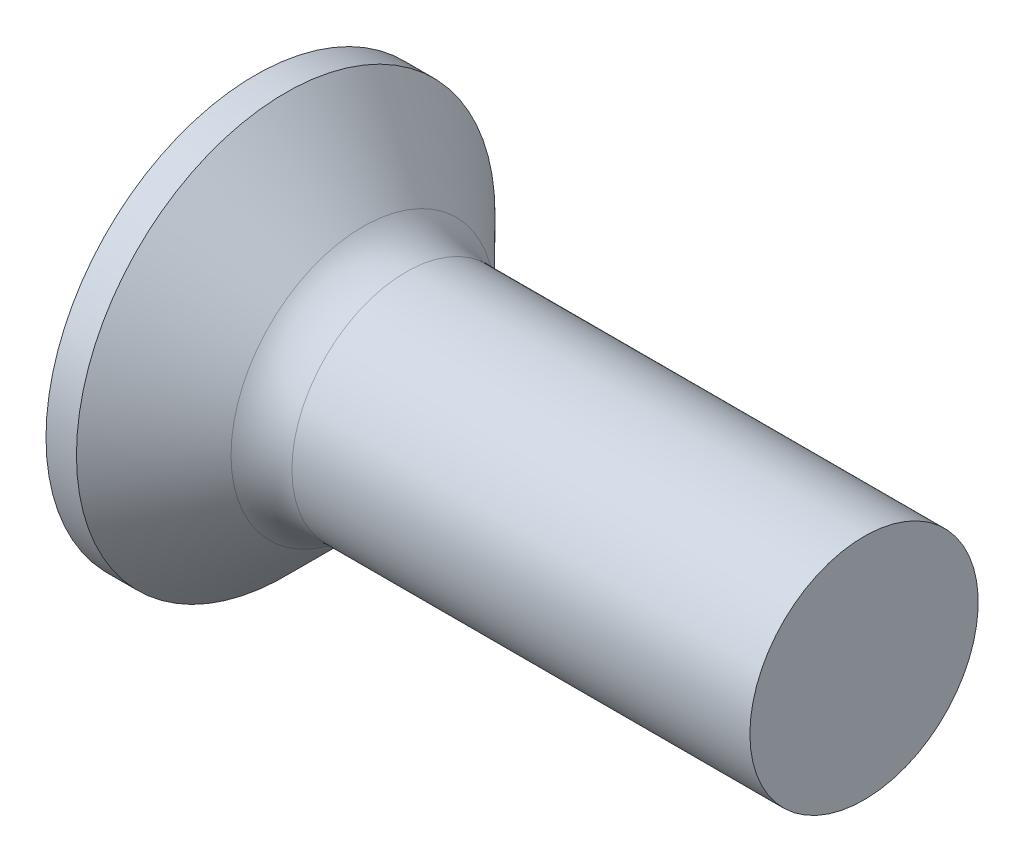
ISO-10303-21;
HEADER;
FILE_DESCRIPTION(('STEP AP214'),'2;1');
FILE_NAME('part.step','',(''),(''),'','','');
FILE_SCHEMA(('AUTOMOTIVE_DESIGN { 1 0 10303 214 1 1 1 1 }'));
ENDSEC;
DATA;
#1=APPLICATION_CONTEXT('core data for automotive mechanical design processes');
#2=APPLICATION_PROTOCOL_DEFINITION('international standard','automotive_design',2000,#1);
#3=PRODUCT_CONTEXT('',#1,'mechanical');
#4=PRODUCT('Part','Part','',(#3));
#5=PRODUCT_RELATED_PRODUCT_CATEGORY('part','',(#4));
#6=PRODUCT_DEFINITION_FORMATION('','',#4);
#7=PRODUCT_DEFINITION_CONTEXT('part definition',#1,'design');
#8=PRODUCT_DEFINITION('design','',#6,#7);
#9=PRODUCT_DEFINITION_SHAPE('','',#8);
#10=(LENGTH_UNIT() NAMED_UNIT(*) SI_UNIT(.MILLI.,.METRE.));
#11=(NAMED_UNIT(*) PLANE_ANGLE_UNIT() SI_UNIT($,.RADIAN.));
#12=(NAMED_UNIT(*) SI_UNIT($,.STERADIAN.) SOLID_ANGLE_UNIT());
#13=UNCERTAINTY_MEASURE_WITH_UNIT(LENGTH_MEASURE(1.E-05),#10,'distance_accuracy_value','');
#14=(GEOMETRIC_REPRESENTATION_CONTEXT(3) GLOBAL_UNCERTAINTY_ASSIGNED_CONTEXT((#13)) GLOBAL_UNIT_ASSIGNED_CONTEXT((#10,
#11,#12)) REPRESENTATION_CONTEXT('',''));
#15=CARTESIAN_POINT('',(0.,0.,0.));
#16=DIRECTION('',(0.,0.,1.));
#17=DIRECTION('',(1.,0.,0.));
#18=AXIS2_PLACEMENT_3D('',#15,#16,#17);
#19=CARTESIAN_POINT('',(2.01,-0.497851135403417,0.37));
#20=DIRECTION('',(0.,0.,-1.));
#21=DIRECTION('',(0.,1.,0.));
#22=AXIS2_PLACEMENT_3D('',#19,#20,#21);
#23=PLANE('',#22);
#24=DIRECTION('',(0.,-1.,0.));
#25=VECTOR('',#24,1.);
#26=CARTESIAN_POINT('',(0.,1.5,0.37));
#27=LINE('',#26,#25);
#28=CARTESIAN_POINT('',(0.,-0.590157547916263,0.37));
#29=VERTEX_POINT('',#28);
#30=CARTESIAN_POINT('',(0.,-1.5,0.37));
#31=VERTEX_POINT('',#30);
#32=EDGE_CURVE('E463',#29,#31,#27,.T.);
#33=ORIENTED_EDGE('',*,*,#32,.F.);
#34=CARTESIAN_POINT('',(-1.01053649691082,-0.672102030072118,0.37));
#35=CARTESIAN_POINT('',(-0.79970605871103,-0.655267098883947,0.37));
#36=CARTESIAN_POINT('',(-0.588886212503304,-0.638297110572311,0.37));
#37=CARTESIAN_POINT('',(-0.167272662529611,-0.603984130519828,0.37));
#38=CARTESIAN_POINT('',(0.0435210406290472,-0.586641131324258,0.37));
#39=CARTESIAN_POINT('',(0.465068838244709,-0.551479911667385,0.37));
#40=CARTESIAN_POINT('',(0.67582293271526,-0.533661691368909,0.37));
#41=CARTESIAN_POINT('',(1.09727362083221,-0.497387538872971,0.37));
#42=CARTESIAN_POINT('',(1.30797021521736,-0.478931615299089,0.37));
#43=CARTESIAN_POINT('',(1.67418894757201,-0.446067164121906,0.37));
#44=CARTESIAN_POINT('',(1.82972932585734,-0.431862501028414,0.37));
#45=CARTESIAN_POINT('',(2.14074770359484,-0.40279770973988,0.37));
#46=CARTESIAN_POINT('',(2.29622570356215,-0.38793758707517,0.37));
#47=CARTESIAN_POINT('',(2.60710169348415,-0.357305117937677,0.37));
#48=CARTESIAN_POINT('',(2.76249967840253,-0.34153271979064,0.37));
#49=CARTESIAN_POINT('',(2.99549070742189,-0.316847908281595,0.37));
#50=CARTESIAN_POINT('',(3.07313791118864,-0.308448465897182,0.37));
#51=CARTESIAN_POINT('',(3.22838341575769,-0.29120225104834,0.37));
#52=CARTESIAN_POINT('',(3.30598171599396,-0.282355473499083,0.37));
#53=CARTESIAN_POINT('',(3.38354828463398,-0.273232461289951,0.37));
#54=B_SPLINE_CURVE_WITH_KNOTS('',3,(#34,#35,#36,#37,#38,#39,#40,#41,#42,#43,#44,#45,#46,#47,#48,
#49,#50,#51,#52,#53),.UNSPECIFIED.,.F.,.F.,(4,2,2,2,2,2,2,2,2,4),(0.,0.634504777554397,
1.26902224766093,1.90353950036111,2.53804817592041,3.00661008438666,3.47516804019383,
3.94375256268972,4.17805198331268,4.41235406779909),.UNSPECIFIED.);
#55=CARTESIAN_POINT('',(2.01,-0.415013252800437,0.37));
#56=VERTEX_POINT('',#55);
#57=EDGE_CURVE('E220',#29,#56,#54,.T.);
#58=ORIENTED_EDGE('',*,*,#57,.T.);
#59=DIRECTION('',(0.,-1.,0.));
#60=VECTOR('',#59,1.);
#61=CARTESIAN_POINT('',(2.01,0.4978511354035,0.37));
#62=LINE('',#61,#60);
#63=CARTESIAN_POINT('',(2.01,-0.497851135403417,0.37));
#64=VERTEX_POINT('',#63);
#65=EDGE_CURVE('E373',#56,#64,#62,.T.);
#66=ORIENTED_EDGE('',*,*,#65,.T.);
#67=DIRECTION('',(0.894934391398435,0.446197753347451,0.));
#68=VECTOR('',#67,1.);
#69=CARTESIAN_POINT('',(0.,-1.5,0.37));
#70=LINE('',#69,#68);
#71=EDGE_CURVE('E471',#31,#64,#70,.T.);
#72=ORIENTED_EDGE('',*,*,#71,.F.);
#73=EDGE_LOOP('',(#33,#58,#66,#72));
#74=FACE_BOUND('',#73,.T.);
#75=ADVANCED_FACE('F40',(#74),#23,.T.);
#76=CARTESIAN_POINT('',(2.01,0.4978511354035,0.37));
#77=VERTEX_POINT('',#76);
#78=CARTESIAN_POINT('',(2.01,0.415013252800437,0.37));
#79=VERTEX_POINT('',#78);
#80=EDGE_CURVE('E369',#77,#79,#62,.T.);
#81=ORIENTED_EDGE('',*,*,#80,.T.);
#82=CARTESIAN_POINT('',(-1.01053649699026,0.672102030078459,0.37));
#83=CARTESIAN_POINT('',(-0.799706058781648,0.65526709888962,0.37));
#84=CARTESIAN_POINT('',(-0.588886212565099,0.638297110577309,0.37));
#85=CARTESIAN_POINT('',(-0.167272662573758,0.603984130523453,0.37));
#86=CARTESIAN_POINT('',(0.043521040593722,0.586641131327185,0.37));
#87=CARTESIAN_POINT('',(0.465068838236453,0.551479911668094,0.37));
#88=CARTESIAN_POINT('',(0.675822932725248,0.533661691368078,0.37));
#89=CARTESIAN_POINT('',(1.09727362087867,0.497387538868943,0.37));
#90=CARTESIAN_POINT('',(1.30797021528206,0.478931615293404,0.37));
#91=CARTESIAN_POINT('',(1.67418894765493,0.446067164114376,0.37));
#92=CARTESIAN_POINT('',(1.82972932594025,0.431862501020785,0.37));
#93=CARTESIAN_POINT('',(2.14074770367772,0.402797709732016,0.37));
#94=CARTESIAN_POINT('',(2.29622570364503,0.38793758706717,0.37));
#95=CARTESIAN_POINT('',(2.60710169356699,0.357305117929346,0.37));
#96=CARTESIAN_POINT('',(2.76249967848536,0.341532719782116,0.37));
#97=CARTESIAN_POINT('',(2.99549070750468,0.316847908272698,0.37));
#98=CARTESIAN_POINT('',(3.07313791127142,0.308448465888148,0.37));
#99=CARTESIAN_POINT('',(3.22838341584044,0.291202251038989,0.37));
#100=CARTESIAN_POINT('',(3.30598171607669,0.282355473489554,0.37));
#101=CARTESIAN_POINT('',(3.38354828471668,0.273232461280216,0.37));
#102=B_SPLINE_CURVE_WITH_KNOTS('',3,(#82,#83,#84,#85,#86,#87,#88,#89,#90,#91,#92,#93,#94,#95,
#96,#97,#98,#99,#100,#101),.UNSPECIFIED.,.F.,.F.,(4,2,2,2,2,2,2,2,2,4),(0.,0.634504777580945,
1.26902224771403,1.90353950046914,2.53804817608336,3.00661008454961,3.47516804035678,
3.94375256285268,4.17805198347564,4.41235406796206),.UNSPECIFIED.);
#103=CARTESIAN_POINT('',(0.,0.590157547916263,0.37));
#104=VERTEX_POINT('',#103);
#105=EDGE_CURVE('E213',#79,#104,#102,.F.);
#106=ORIENTED_EDGE('',*,*,#105,.T.);
#107=CARTESIAN_POINT('',(0.,1.5,0.37));
#108=VERTEX_POINT('',#107);
#109=EDGE_CURVE('E465',#108,#104,#27,.T.);
#110=ORIENTED_EDGE('',*,*,#109,.F.);
#111=DIRECTION('',(0.89493439139845,-0.446197753347421,0.));
#112=VECTOR('',#111,1.);
#113=CARTESIAN_POINT('',(0.,1.5,0.37));
#114=LINE('',#113,#112);
#115=EDGE_CURVE('E63',#108,#77,#114,.T.);
#116=ORIENTED_EDGE('',*,*,#115,.T.);
#117=EDGE_LOOP('',(#81,#106,#110,#116));
#118=FACE_BOUND('',#117,.T.);
#119=ADVANCED_FACE('F194',(#118),#23,.T.);
#120=CARTESIAN_POINT('',(2.01,0.4978511354035,-0.37));
#121=DIRECTION('',(0.,0.,1.));
#122=DIRECTION('',(1.,0.,0.));
#123=AXIS2_PLACEMENT_3D('',#120,#121,#122);
#124=PLANE('',#123);
#125=DIRECTION('',(0.,1.,0.));
#126=VECTOR('',#125,1.);
#127=CARTESIAN_POINT('',(2.01,-0.497851135403417,-0.37));
#128=LINE('',#127,#126);
#129=CARTESIAN_POINT('',(2.01,-0.497851135403417,-0.37));
#130=VERTEX_POINT('',#129);
#131=CARTESIAN_POINT('',(2.01,-0.415013252800437,-0.37));
#132=VERTEX_POINT('',#131);
#133=EDGE_CURVE('E382',#130,#132,#128,.T.);
#134=ORIENTED_EDGE('',*,*,#133,.T.);
#135=CARTESIAN_POINT('',(-1.01053649691082,-0.672102030072118,-0.37));
#136=CARTESIAN_POINT('',(-0.79970605871103,-0.655267098883947,-0.37));
#137=CARTESIAN_POINT('',(-0.588886212503305,-0.638297110572311,-0.37));
#138=CARTESIAN_POINT('',(-0.16727266252961,-0.603984130519828,-0.37));
#139=CARTESIAN_POINT('',(0.0435210406290472,-0.586641131324259,-0.37));
#140=CARTESIAN_POINT('',(0.465068838244709,-0.551479911667385,-0.37));
#141=CARTESIAN_POINT('',(0.67582293271526,-0.533661691368909,-0.37));
#142=CARTESIAN_POINT('',(1.09727362083221,-0.497387538872971,-0.37));
#143=CARTESIAN_POINT('',(1.30797021521736,-0.47893161529909,-0.37));
#144=CARTESIAN_POINT('',(1.67418894757201,-0.446067164121906,-0.37));
#145=CARTESIAN_POINT('',(1.82972932585734,-0.431862501028414,-0.37));
#146=CARTESIAN_POINT('',(2.14074770359484,-0.40279770973988,-0.37));
#147=CARTESIAN_POINT('',(2.29622570356215,-0.38793758707517,-0.37));
#148=CARTESIAN_POINT('',(2.60710169348415,-0.357305117937677,-0.37));
#149=CARTESIAN_POINT('',(2.76249967840254,-0.34153271979064,-0.37));
#150=CARTESIAN_POINT('',(2.99549070742189,-0.316847908281595,-0.37));
#151=CARTESIAN_POINT('',(3.07313791118864,-0.308448465897182,-0.37));
#152=CARTESIAN_POINT('',(3.22838341575769,-0.29120225104834,-0.37));
#153=CARTESIAN_POINT('',(3.30598171599396,-0.282355473499083,-0.37));
#154=CARTESIAN_POINT('',(3.38354828463398,-0.273232461289951,-0.37));
#155=B_SPLINE_CURVE_WITH_KNOTS('',3,(#135,#136,#137,#138,#139,#140,#141,#142,#143,#144,#145,
#146,#147,#148,#149,#150,#151,#152,#153,#154),.UNSPECIFIED.,.F.,.F.,(4,2,2,2,2,2,2,2,2,4),(0.,
0.634504777554397,1.26902224766093,1.90353950036111,2.53804817592041,3.00661008438666,
3.47516804019383,3.94375256268973,4.17805198331268,4.41235406779909),.UNSPECIFIED.);
#156=CARTESIAN_POINT('',(0.,-0.590157547916263,-0.37));
#157=VERTEX_POINT('',#156);
#158=EDGE_CURVE('E276',#132,#157,#155,.F.);
#159=ORIENTED_EDGE('',*,*,#158,.T.);
#160=DIRECTION('',(0.,1.,0.));
#161=VECTOR('',#160,1.);
#162=CARTESIAN_POINT('',(0.,-1.5,-0.37));
#163=LINE('',#162,#161);
#164=CARTESIAN_POINT('',(0.,-1.5,-0.37));
#165=VERTEX_POINT('',#164);
#166=EDGE_CURVE('E464',#165,#157,#163,.T.);
#167=ORIENTED_EDGE('',*,*,#166,.F.);
#168=DIRECTION('',(0.894934391398435,0.446197753347451,0.));
#169=VECTOR('',#168,1.);
#170=CARTESIAN_POINT('',(0.,-1.5,-0.37));
#171=LINE('',#170,#169);
#172=EDGE_CURVE('E474',#165,#130,#171,.T.);
#173=ORIENTED_EDGE('',*,*,#172,.T.);
#174=EDGE_LOOP('',(#134,#159,#167,#173));
#175=FACE_BOUND('',#174,.T.);
#176=ADVANCED_FACE('F201',(#175),#124,.T.);
#177=CARTESIAN_POINT('',(0.,0.590157547916263,-0.37));
#178=VERTEX_POINT('',#177);
#179=CARTESIAN_POINT('',(0.,1.5,-0.37));
#180=VERTEX_POINT('',#179);
#181=EDGE_CURVE('E470',#178,#180,#163,.T.);
#182=ORIENTED_EDGE('',*,*,#181,.F.);
#183=CARTESIAN_POINT('',(-1.01053649691082,0.672102030072118,-0.37));
#184=CARTESIAN_POINT('',(-0.79970605871103,0.655267098883947,-0.37));
#185=CARTESIAN_POINT('',(-0.588886212503304,0.638297110572311,-0.37));
#186=CARTESIAN_POINT('',(-0.16727266252961,0.603984130519828,-0.37));
#187=CARTESIAN_POINT('',(0.0435210406290473,0.586641131324259,-0.37));
#188=CARTESIAN_POINT('',(0.465068838244709,0.551479911667385,-0.37));
#189=CARTESIAN_POINT('',(0.67582293271526,0.533661691368909,-0.37));
#190=CARTESIAN_POINT('',(1.09727362083221,0.497387538872971,-0.37));
#191=CARTESIAN_POINT('',(1.30797021521736,0.478931615299089,-0.37));
#192=CARTESIAN_POINT('',(1.67418894757201,0.446067164121906,-0.37));
#193=CARTESIAN_POINT('',(1.82972932585734,0.431862501028415,-0.37));
#194=CARTESIAN_POINT('',(2.14074770359484,0.40279770973988,-0.37));
#195=CARTESIAN_POINT('',(2.29622570356215,0.38793758707517,-0.37));
#196=CARTESIAN_POINT('',(2.60710169348415,0.357305117937677,-0.37));
#197=CARTESIAN_POINT('',(2.76249967840253,0.34153271979064,-0.37));
#198=CARTESIAN_POINT('',(2.99549070742189,0.316847908281595,-0.37));
#199=CARTESIAN_POINT('',(3.07313791118864,0.308448465897183,-0.37));
#200=CARTESIAN_POINT('',(3.22838341575769,0.29120225104834,-0.37));
#201=CARTESIAN_POINT('',(3.30598171599396,0.282355473499083,-0.37));
#202=CARTESIAN_POINT('',(3.38354828463398,0.273232461289951,-0.37));
#203=B_SPLINE_CURVE_WITH_KNOTS('',3,(#183,#184,#185,#186,#187,#188,#189,#190,#191,#192,#193,
#194,#195,#196,#197,#198,#199,#200,#201,#202),.UNSPECIFIED.,.F.,.F.,(4,2,2,2,2,2,2,2,2,4),(0.,
0.634504777554397,1.26902224766093,1.90353950036111,2.53804817592041,3.00661008438666,
3.47516804019383,3.94375256268972,4.17805198331267,4.41235406779909),.UNSPECIFIED.);
#204=CARTESIAN_POINT('',(2.01,0.415013252800437,-0.37));
#205=VERTEX_POINT('',#204);
#206=EDGE_CURVE('E270',#178,#205,#203,.T.);
#207=ORIENTED_EDGE('',*,*,#206,.T.);
#208=CARTESIAN_POINT('',(2.01,0.4978511354035,-0.37));
#209=VERTEX_POINT('',#208);
#210=EDGE_CURVE('E384',#205,#209,#128,.T.);
#211=ORIENTED_EDGE('',*,*,#210,.T.);
#212=DIRECTION('',(0.89493439139845,-0.446197753347421,0.));
#213=VECTOR('',#212,1.);
#214=CARTESIAN_POINT('',(0.,1.5,-0.37));
#215=LINE('',#214,#213);
#216=EDGE_CURVE('E381',#180,#209,#215,.T.);
#217=ORIENTED_EDGE('',*,*,#216,.F.);
#218=EDGE_LOOP('',(#182,#207,#211,#217));
#219=FACE_BOUND('',#218,.T.);
#220=ADVANCED_FACE('F481',(#219),#124,.T.);
#221=CARTESIAN_POINT('',(2.01,0.4978511354035,-0.37));
#222=DIRECTION('',(1.,0.,0.));
#223=DIRECTION('',(0.,0.,-1.));
#224=AXIS2_PLACEMENT_3D('',#221,#222,#223);
#225=PLANE('',#224);
#226=CARTESIAN_POINT('',(2.01,0.,0.));
#227=DIRECTION('',(-1.,0.,0.));
#228=DIRECTION('',(0.,0.,1.));
#229=AXIS2_PLACEMENT_3D('',#226,#227,#228);
#230=CIRCLE('',#229,0.555999999999999);
#231=CARTESIAN_POINT('',(2.01,-0.247548473995554,-0.497851135403418));
#232=VERTEX_POINT('',#231);
#233=CARTESIAN_POINT('',(2.01,-0.369999999999999,-0.415013252800438));
#234=VERTEX_POINT('',#233);
#235=EDGE_CURVE('E348',#232,#234,#230,.T.);
#236=ORIENTED_EDGE('',*,*,#235,.F.);
#237=DIRECTION('',(0.,1.,0.));
#238=VECTOR('',#237,1.);
#239=CARTESIAN_POINT('',(2.01,-0.369999999999998,-0.497851135403418));
#240=LINE('',#239,#238);
#241=CARTESIAN_POINT('',(2.01,-0.369999999999998,-0.497851135403418));
#242=VERTEX_POINT('',#241);
#243=EDGE_CURVE('E448',#242,#232,#240,.T.);
#244=ORIENTED_EDGE('',*,*,#243,.F.);
#245=DIRECTION('',(0.,0.,-1.));
#246=VECTOR('',#245,1.);
#247=CARTESIAN_POINT('',(2.01,-0.370000000000002,0.497851135403499));
#248=LINE('',#247,#246);
#249=EDGE_CURVE('E452',#234,#242,#248,.T.);
#250=ORIENTED_EDGE('',*,*,#249,.F.);
#251=EDGE_LOOP('',(#236,#244,#250));
#252=FACE_BOUND('',#251,.T.);
#253=ADVANCED_FACE('F494',(#252),#225,.F.);
#254=CARTESIAN_POINT('',(2.01,-0.497851135403417,-0.247548473995555));
#255=VERTEX_POINT('',#254);
#256=EDGE_CURVE('E343',#132,#255,#230,.T.);
#257=ORIENTED_EDGE('',*,*,#256,.F.);
#258=ORIENTED_EDGE('',*,*,#133,.F.);
#259=DIRECTION('',(0.,0.,-1.));
#260=VECTOR('',#259,1.);
#261=CARTESIAN_POINT('',(2.01,-0.497851135403417,0.37));
#262=LINE('',#261,#260);
#263=EDGE_CURVE('E372',#255,#130,#262,.T.);
#264=ORIENTED_EDGE('',*,*,#263,.F.);
#265=EDGE_LOOP('',(#257,#258,#264));
#266=FACE_BOUND('',#265,.T.);
#267=ADVANCED_FACE('F500',(#266),#225,.F.);
#268=CARTESIAN_POINT('',(2.01,-0.497851135403417,0.247548473995555));
#269=VERTEX_POINT('',#268);
#270=EDGE_CURVE('E338',#269,#56,#230,.T.);
#271=ORIENTED_EDGE('',*,*,#270,.F.);
#272=EDGE_CURVE('E375',#64,#269,#262,.T.);
#273=ORIENTED_EDGE('',*,*,#272,.F.);
#274=ORIENTED_EDGE('',*,*,#65,.F.);
#275=EDGE_LOOP('',(#271,#273,#274));
#276=FACE_BOUND('',#275,.T.);
#277=ADVANCED_FACE('F506',(#276),#225,.F.);
#278=CARTESIAN_POINT('',(2.01,-0.370000000000001,0.415013252800436));
#279=VERTEX_POINT('',#278);
#280=CARTESIAN_POINT('',(2.01,-0.24754847399539,0.497851135403499));
#281=VERTEX_POINT('',#280);
#282=EDGE_CURVE('E55',#279,#281,#230,.T.);
#283=ORIENTED_EDGE('',*,*,#282,.F.);
#284=CARTESIAN_POINT('',(2.01,-0.370000000000002,0.497851135403499));
#285=VERTEX_POINT('',#284);
#286=EDGE_CURVE('E454',#285,#279,#248,.T.);
#287=ORIENTED_EDGE('',*,*,#286,.F.);
#288=DIRECTION('',(0.,-1.,0.));
#289=VECTOR('',#288,1.);
#290=CARTESIAN_POINT('',(2.01,0.369999999999998,0.497851135403501));
#291=LINE('',#290,#289);
#292=EDGE_CURVE('E453',#281,#285,#291,.T.);
#293=ORIENTED_EDGE('',*,*,#292,.F.);
#294=EDGE_LOOP('',(#283,#287,#293));
#295=FACE_BOUND('',#294,.T.);
#296=ADVANCED_FACE('F533',(#295),#225,.F.);
#297=CARTESIAN_POINT('',(2.01,0.247548473995386,0.497851135403501));
#298=VERTEX_POINT('',#297);
#299=CARTESIAN_POINT('',(2.01,0.369999999999999,0.415013252800438));
#300=VERTEX_POINT('',#299);
#301=EDGE_CURVE('E329',#298,#300,#230,.T.);
#302=ORIENTED_EDGE('',*,*,#301,.F.);
#303=CARTESIAN_POINT('',(2.01,0.369999999999998,0.497851135403501));
#304=VERTEX_POINT('',#303);
#305=EDGE_CURVE('E449',#304,#298,#291,.T.);
#306=ORIENTED_EDGE('',*,*,#305,.F.);
#307=DIRECTION('',(0.,0.,1.));
#308=VECTOR('',#307,1.);
#309=CARTESIAN_POINT('',(2.01,0.370000000000002,-0.497851135403416));
#310=LINE('',#309,#308);
#311=EDGE_CURVE('E227',#300,#304,#310,.T.);
#312=ORIENTED_EDGE('',*,*,#311,.F.);
#313=EDGE_LOOP('',(#302,#306,#312));
#314=FACE_BOUND('',#313,.T.);
#315=ADVANCED_FACE('F490',(#314),#225,.F.);
#316=CARTESIAN_POINT('',(2.01,0.4978511354035,0.247548473995388));
#317=VERTEX_POINT('',#316);
#318=EDGE_CURVE('E336',#79,#317,#230,.T.);
#319=ORIENTED_EDGE('',*,*,#318,.F.);
#320=ORIENTED_EDGE('',*,*,#80,.F.);
#321=DIRECTION('',(0.,0.,1.));
#322=VECTOR('',#321,1.);
#323=CARTESIAN_POINT('',(2.01,0.4978511354035,-0.37));
#324=LINE('',#323,#322);
#325=EDGE_CURVE('E370',#317,#77,#324,.T.);
#326=ORIENTED_EDGE('',*,*,#325,.F.);
#327=EDGE_LOOP('',(#319,#320,#326));
#328=FACE_BOUND('',#327,.T.);
#329=ADVANCED_FACE('F368',(#328),#225,.F.);
#330=CARTESIAN_POINT('',(2.01,0.4978511354035,-0.247548473995388));
#331=VERTEX_POINT('',#330);
#332=EDGE_CURVE('E358',#331,#205,#230,.T.);
#333=ORIENTED_EDGE('',*,*,#332,.F.);
#334=EDGE_CURVE('E377',#209,#331,#324,.T.);
#335=ORIENTED_EDGE('',*,*,#334,.F.);
#336=ORIENTED_EDGE('',*,*,#210,.F.);
#337=EDGE_LOOP('',(#333,#335,#336));
#338=FACE_BOUND('',#337,.T.);
#339=ADVANCED_FACE('F483',(#338),#225,.F.);
#340=CARTESIAN_POINT('',(2.01,-0.497851135403417,-0.37));
#341=DIRECTION('',(-0.446197753347451,0.894934391398435,0.));
#342=DIRECTION('',(-0.894934391398435,-0.446197753347451,0.));
#343=AXIS2_PLACEMENT_3D('',#340,#341,#342);
#344=PLANE('',#343);
#345=ORIENTED_EDGE('',*,*,#272,.T.);
#346=CARTESIAN_POINT('',(2.86902919914407,-0.0695550475538948,0.));
#347=DIRECTION('',(-0.446197753347451,0.894934391398435,0.));
#348=DIRECTION('',(-0.894934391398435,-0.446197753347451,0.));
#349=AXIS2_PLACEMENT_3D('',#346,#347,#348);
#350=ELLIPSE('',#349,1.11145971268775,0.491029001453367);
#351=EDGE_CURVE('E288',#269,#255,#350,.F.);
#352=ORIENTED_EDGE('',*,*,#351,.T.);
#353=ORIENTED_EDGE('',*,*,#263,.T.);
#354=ORIENTED_EDGE('',*,*,#172,.F.);
#355=DIRECTION('',(0.,0.,-1.));
#356=VECTOR('',#355,1.);
#357=CARTESIAN_POINT('',(0.,-1.5,0.37));
#358=LINE('',#357,#356);
#359=EDGE_CURVE('E389',#31,#165,#358,.T.);
#360=ORIENTED_EDGE('',*,*,#359,.F.);
#361=ORIENTED_EDGE('',*,*,#71,.T.);
#362=EDGE_LOOP('',(#345,#352,#353,#354,#360,#361));
#363=FACE_BOUND('',#362,.T.);
#364=ADVANCED_FACE('F207',(#363),#344,.T.);
#365=CARTESIAN_POINT('',(2.01,0.4978511354035,0.37));
#366=DIRECTION('',(-0.446197753347421,-0.89493439139845,0.));
#367=DIRECTION('',(0.89493439139845,-0.446197753347421,0.));
#368=AXIS2_PLACEMENT_3D('',#365,#366,#367);
#369=PLANE('',#368);
#370=ORIENTED_EDGE('',*,*,#334,.T.);
#371=CARTESIAN_POINT('',(2.8690291991443,0.069555047553898,0.));
#372=DIRECTION('',(-0.446197753347421,-0.89493439139845,0.));
#373=DIRECTION('',(-0.89493439139845,0.446197753347421,0.));
#374=AXIS2_PLACEMENT_3D('',#371,#372,#373);
#375=ELLIPSE('',#374,1.11145971268778,0.49102900145335);
#376=EDGE_CURVE('E293',#331,#317,#375,.F.);
#377=ORIENTED_EDGE('',*,*,#376,.T.);
#378=ORIENTED_EDGE('',*,*,#325,.T.);
#379=ORIENTED_EDGE('',*,*,#115,.F.);
#380=DIRECTION('',(0.,0.,1.));
#381=VECTOR('',#380,1.);
#382=CARTESIAN_POINT('',(0.,1.5,-0.37));
#383=LINE('',#382,#381);
#384=EDGE_CURVE('E460',#180,#108,#383,.T.);
#385=ORIENTED_EDGE('',*,*,#384,.F.);
#386=ORIENTED_EDGE('',*,*,#216,.T.);
#387=EDGE_LOOP('',(#370,#377,#378,#379,#385,#386));
#388=FACE_BOUND('',#387,.T.);
#389=ADVANCED_FACE('F479',(#388),#369,.T.);
#390=CARTESIAN_POINT('',(2.01,0.369999999999998,0.497851135403501));
#391=DIRECTION('',(0.,-1.,0.));
#392=DIRECTION('',(1.,0.,0.));
#393=AXIS2_PLACEMENT_3D('',#390,#391,#392);
#394=PLANE('',#393);
#395=CARTESIAN_POINT('',(2.01,0.370000000000002,-0.497851135403416));
#396=VERTEX_POINT('',#395);
#397=CARTESIAN_POINT('',(2.01,0.370000000000001,-0.415013252800436));
#398=VERTEX_POINT('',#397);
#399=EDGE_CURVE('E458',#396,#398,#310,.T.);
#400=ORIENTED_EDGE('',*,*,#399,.T.);
#401=CARTESIAN_POINT('',(-1.01053649699026,0.370000000000002,-0.672102030078458));
#402=CARTESIAN_POINT('',(-0.799706058781648,0.370000000000002,-0.655267098889619));
#403=CARTESIAN_POINT('',(-0.588886212565099,0.370000000000002,-0.638297110577308));
#404=CARTESIAN_POINT('',(-0.167272662573758,0.370000000000002,-0.603984130523452));
#405=CARTESIAN_POINT('',(0.0435210405937218,0.370000000000002,-0.586641131327184));
#406=CARTESIAN_POINT('',(0.465068838236452,0.370000000000002,-0.551479911668093));
#407=CARTESIAN_POINT('',(0.675822932725247,0.370000000000002,-0.533661691368077));
#408=CARTESIAN_POINT('',(1.09727362087867,0.370000000000002,-0.497387538868942));
#409=CARTESIAN_POINT('',(1.30797021528206,0.370000000000002,-0.478931615293403));
#410=CARTESIAN_POINT('',(1.67418894765493,0.370000000000001,-0.446067164114375));
#411=CARTESIAN_POINT('',(1.82972932594025,0.370000000000001,-0.431862501020784));
#412=CARTESIAN_POINT('',(2.14074770367772,0.370000000000001,-0.402797709732014));
#413=CARTESIAN_POINT('',(2.29622570364503,0.370000000000001,-0.387937587067169));
#414=CARTESIAN_POINT('',(2.60710169356699,0.370000000000001,-0.357305117929345));
#415=CARTESIAN_POINT('',(2.76249967848536,0.370000000000001,-0.341532719782114));
#416=CARTESIAN_POINT('',(2.99549070750468,0.370000000000001,-0.316847908272697));
#417=CARTESIAN_POINT('',(3.07313791127142,0.370000000000001,-0.308448465888147));
#418=CARTESIAN_POINT('',(3.22838341584044,0.370000000000001,-0.291202251038988));
#419=CARTESIAN_POINT('',(3.30598171607669,0.370000000000001,-0.282355473489552));
#420=CARTESIAN_POINT('',(3.38354828471668,0.370000000000001,-0.273232461280215));
#421=B_SPLINE_CURVE_WITH_KNOTS('',3,(#401,#402,#403,#404,#405,#406,#407,#408,#409,#410,#411,
#412,#413,#414,#415,#416,#417,#418,#419,#420),.UNSPECIFIED.,.F.,.F.,(4,2,2,2,2,2,2,2,2,4),(0.,
0.634504777580945,1.26902224771403,1.90353950046914,2.53804817608336,3.00661008454961,
3.47516804035678,3.94375256285268,4.17805198347564,4.41235406796206),.UNSPECIFIED.);
#422=CARTESIAN_POINT('',(0.,0.370000000000002,-0.590157547916262));
#423=VERTEX_POINT('',#422);
#424=EDGE_CURVE('E262',#398,#423,#421,.F.);
#425=ORIENTED_EDGE('',*,*,#424,.T.);
#426=DIRECTION('',(0.,0.,1.));
#427=VECTOR('',#426,1.);
#428=CARTESIAN_POINT('',(0.,0.370000000000005,-1.5));
#429=LINE('',#428,#427);
#430=CARTESIAN_POINT('',(0.,0.370000000000005,-1.5));
#431=VERTEX_POINT('',#430);
#432=EDGE_CURVE('E434',#431,#423,#429,.T.);
#433=ORIENTED_EDGE('',*,*,#432,.F.);
#434=DIRECTION('',(0.894934391398435,0.,0.446197753347451));
#435=VECTOR('',#434,1.);
#436=CARTESIAN_POINT('',(0.,0.370000000000005,-1.5));
#437=LINE('',#436,#435);
#438=EDGE_CURVE('E440',#431,#396,#437,.T.);
#439=ORIENTED_EDGE('',*,*,#438,.T.);
#440=EDGE_LOOP('',(#400,#425,#433,#439));
#441=FACE_BOUND('',#440,.T.);
#442=ADVANCED_FACE('F614',(#441),#394,.T.);
#443=CARTESIAN_POINT('',(2.01,-0.369999999999998,-0.497851135403418));
#444=DIRECTION('',(0.,1.,0.));
#445=DIRECTION('',(0.,0.,1.));
#446=AXIS2_PLACEMENT_3D('',#443,#444,#445);
#447=PLANE('',#446);
#448=DIRECTION('',(0.,0.,-1.));
#449=VECTOR('',#448,1.);
#450=CARTESIAN_POINT('',(0.,-0.370000000000005,1.5));
#451=LINE('',#450,#449);
#452=CARTESIAN_POINT('',(0.,-0.369999999999998,-0.590157547916264));
#453=VERTEX_POINT('',#452);
#454=CARTESIAN_POINT('',(0.,-0.369999999999995,-1.5));
#455=VERTEX_POINT('',#454);
#456=EDGE_CURVE('E430',#453,#455,#451,.T.);
#457=ORIENTED_EDGE('',*,*,#456,.F.);
#458=CARTESIAN_POINT('',(-1.01053649699026,-0.369999999999998,-0.67210203007846));
#459=CARTESIAN_POINT('',(-0.799706058781648,-0.369999999999998,-0.655267098889622));
#460=CARTESIAN_POINT('',(-0.588886212565099,-0.369999999999998,-0.638297110577311));
#461=CARTESIAN_POINT('',(-0.167272662573759,-0.369999999999998,-0.603984130523454));
#462=CARTESIAN_POINT('',(0.0435210405937218,-0.369999999999998,-0.586641131327186));
#463=CARTESIAN_POINT('',(0.465068838236453,-0.369999999999998,-0.551479911668095));
#464=CARTESIAN_POINT('',(0.675822932725248,-0.369999999999998,-0.53366169136808));
#465=CARTESIAN_POINT('',(1.09727362087867,-0.369999999999998,-0.497387538868944));
#466=CARTESIAN_POINT('',(1.30797021528206,-0.369999999999998,-0.478931615293405));
#467=CARTESIAN_POINT('',(1.67418894765493,-0.369999999999999,-0.446067164114377));
#468=CARTESIAN_POINT('',(1.82972932594025,-0.369999999999999,-0.431862501020786));
#469=CARTESIAN_POINT('',(2.14074770367772,-0.369999999999999,-0.402797709732017));
#470=CARTESIAN_POINT('',(2.29622570364503,-0.369999999999999,-0.387937587067171));
#471=CARTESIAN_POINT('',(2.60710169356699,-0.369999999999999,-0.357305117929348));
#472=CARTESIAN_POINT('',(2.76249967848536,-0.369999999999999,-0.341532719782117));
#473=CARTESIAN_POINT('',(2.99549070750468,-0.369999999999999,-0.316847908272699));
#474=CARTESIAN_POINT('',(3.07313791127142,-0.369999999999999,-0.30844846588815));
#475=CARTESIAN_POINT('',(3.22838341584044,-0.369999999999999,-0.291202251038991));
#476=CARTESIAN_POINT('',(3.30598171607669,-0.369999999999999,-0.282355473489555));
#477=CARTESIAN_POINT('',(3.38354828471668,-0.369999999999999,-0.273232461280217));
#478=B_SPLINE_CURVE_WITH_KNOTS('',3,(#458,#459,#460,#461,#462,#463,#464,#465,#466,#467,#468,
#469,#470,#471,#472,#473,#474,#475,#476,#477),.UNSPECIFIED.,.F.,.F.,(4,2,2,2,2,2,2,2,2,4),(0.,
0.634504777580943,1.26902224771403,1.90353950046914,2.53804817608336,3.00661008454961,
3.47516804035678,3.94375256285268,4.17805198347564,4.41235406796206),.UNSPECIFIED.);
#479=EDGE_CURVE('E255',#453,#234,#478,.T.);
#480=ORIENTED_EDGE('',*,*,#479,.T.);
#481=ORIENTED_EDGE('',*,*,#249,.T.);
#482=DIRECTION('',(0.894934391398435,0.,0.446197753347451));
#483=VECTOR('',#482,1.);
#484=CARTESIAN_POINT('',(0.,-0.369999999999995,-1.5));
#485=LINE('',#484,#483);
#486=EDGE_CURVE('E437',#455,#242,#485,.T.);
#487=ORIENTED_EDGE('',*,*,#486,.F.);
#488=EDGE_LOOP('',(#457,#480,#481,#487));
#489=FACE_BOUND('',#488,.T.);
#490=ADVANCED_FACE('F511',(#489),#447,.T.);
#491=CARTESIAN_POINT('',(2.01,0.370000000000002,-0.497851135403416));
#492=DIRECTION('',(-0.446197753347451,0.,0.894934391398435));
#493=DIRECTION('',(-0.894934391398435,0.,-0.446197753347451));
#494=AXIS2_PLACEMENT_3D('',#491,#492,#493);
#495=PLANE('',#494);
#496=ORIENTED_EDGE('',*,*,#243,.T.);
#497=CARTESIAN_POINT('',(2.86902919914407,0.,-0.0695550475538948));
#498=DIRECTION('',(-0.446197753347451,0.,0.894934391398435));
#499=DIRECTION('',(-0.894934391398435,0.,-0.446197753347451));
#500=AXIS2_PLACEMENT_3D('',#497,#498,#499);
#501=ELLIPSE('',#500,1.11145971268775,0.491029001453367);
#502=CARTESIAN_POINT('',(2.01,0.247548473995557,-0.497851135403416));
#503=VERTEX_POINT('',#502);
#504=EDGE_CURVE('E306',#232,#503,#501,.F.);
#505=ORIENTED_EDGE('',*,*,#504,.T.);
#506=EDGE_CURVE('E456',#503,#396,#240,.T.);
#507=ORIENTED_EDGE('',*,*,#506,.T.);
#508=ORIENTED_EDGE('',*,*,#438,.F.);
#509=DIRECTION('',(0.,1.,0.));
#510=VECTOR('',#509,1.);
#511=CARTESIAN_POINT('',(0.,-0.369999999999995,-1.5));
#512=LINE('',#511,#510);
#513=EDGE_CURVE('E429',#455,#431,#512,.T.);
#514=ORIENTED_EDGE('',*,*,#513,.F.);
#515=ORIENTED_EDGE('',*,*,#486,.T.);
#516=EDGE_LOOP('',(#496,#505,#507,#508,#514,#515));
#517=FACE_BOUND('',#516,.T.);
#518=ADVANCED_FACE('F232',(#517),#495,.T.);
#519=ORIENTED_EDGE('',*,*,#286,.T.);
#520=CARTESIAN_POINT('',(-1.01053649699026,-0.370000000000002,0.672102030078458));
#521=CARTESIAN_POINT('',(-0.799706058781648,-0.370000000000002,0.655267098889619));
#522=CARTESIAN_POINT('',(-0.588886212565099,-0.370000000000002,0.638297110577308));
#523=CARTESIAN_POINT('',(-0.167272662573758,-0.370000000000002,0.603984130523451));
#524=CARTESIAN_POINT('',(0.0435210405937218,-0.370000000000002,0.586641131327183));
#525=CARTESIAN_POINT('',(0.465068838236452,-0.370000000000002,0.551479911668093));
#526=CARTESIAN_POINT('',(0.675822932725247,-0.370000000000002,0.533661691368077));
#527=CARTESIAN_POINT('',(1.09727362087867,-0.370000000000002,0.497387538868942));
#528=CARTESIAN_POINT('',(1.30797021528206,-0.370000000000002,0.478931615293403));
#529=CARTESIAN_POINT('',(1.67418894765493,-0.370000000000002,0.446067164114375));
#530=CARTESIAN_POINT('',(1.82972932594025,-0.370000000000001,0.431862501020784));
#531=CARTESIAN_POINT('',(2.14074770367772,-0.370000000000001,0.402797709732014));
#532=CARTESIAN_POINT('',(2.29622570364503,-0.370000000000001,0.387937587067169));
#533=CARTESIAN_POINT('',(2.60710169356699,-0.370000000000001,0.357305117929345));
#534=CARTESIAN_POINT('',(2.76249967848536,-0.370000000000001,0.341532719782114));
#535=CARTESIAN_POINT('',(2.99549070750468,-0.370000000000001,0.316847908272697));
#536=CARTESIAN_POINT('',(3.07313791127142,-0.370000000000001,0.308448465888147));
#537=CARTESIAN_POINT('',(3.22838341584044,-0.370000000000001,0.291202251038988));
#538=CARTESIAN_POINT('',(3.30598171607669,-0.370000000000001,0.282355473489552));
#539=CARTESIAN_POINT('',(3.38354828471668,-0.370000000000001,0.273232461280214));
#540=B_SPLINE_CURVE_WITH_KNOTS('',3,(#520,#521,#522,#523,#524,#525,#526,#527,#528,#529,#530,
#531,#532,#533,#534,#535,#536,#537,#538,#539),.UNSPECIFIED.,.F.,.F.,(4,2,2,2,2,2,2,2,2,4),(0.,
0.634504777580945,1.26902224771403,1.90353950046914,2.53804817608336,3.00661008454961,
3.47516804035678,3.94375256285268,4.17805198347564,4.41235406796206),.UNSPECIFIED.);
#541=CARTESIAN_POINT('',(0.,-0.370000000000002,0.590157547916262));
#542=VERTEX_POINT('',#541);
#543=EDGE_CURVE('E247',#279,#542,#540,.F.);
#544=ORIENTED_EDGE('',*,*,#543,.T.);
#545=CARTESIAN_POINT('',(0.,-0.370000000000005,1.5));
#546=VERTEX_POINT('',#545);
#547=EDGE_CURVE('E425',#546,#542,#451,.T.);
#548=ORIENTED_EDGE('',*,*,#547,.F.);
#549=DIRECTION('',(0.89493439139845,0.,-0.446197753347421));
#550=VECTOR('',#549,1.);
#551=CARTESIAN_POINT('',(0.,-0.370000000000005,1.5));
#552=LINE('',#551,#550);
#553=EDGE_CURVE('E443',#546,#285,#552,.T.);
#554=ORIENTED_EDGE('',*,*,#553,.T.);
#555=EDGE_LOOP('',(#519,#544,#548,#554));
#556=FACE_BOUND('',#555,.T.);
#557=ADVANCED_FACE('F531',(#556),#447,.T.);
#558=CARTESIAN_POINT('',(0.,0.369999999999998,0.590157547916264));
#559=VERTEX_POINT('',#558);
#560=CARTESIAN_POINT('',(0.,0.369999999999995,1.5));
#561=VERTEX_POINT('',#560);
#562=EDGE_CURVE('E436',#559,#561,#429,.T.);
#563=ORIENTED_EDGE('',*,*,#562,.F.);
#564=CARTESIAN_POINT('',(-1.01053649699026,0.369999999999997,0.67210203007846));
#565=CARTESIAN_POINT('',(-0.799706058781648,0.369999999999998,0.655267098889622));
#566=CARTESIAN_POINT('',(-0.588886212565098,0.369999999999998,0.638297110577311));
#567=CARTESIAN_POINT('',(-0.167272662573758,0.369999999999998,0.603984130523454));
#568=CARTESIAN_POINT('',(0.043521040593722,0.369999999999998,0.586641131327186));
#569=CARTESIAN_POINT('',(0.465068838236453,0.369999999999998,0.551479911668095));
#570=CARTESIAN_POINT('',(0.675822932725248,0.369999999999998,0.53366169136808));
#571=CARTESIAN_POINT('',(1.09727362087867,0.369999999999998,0.497387538868944));
#572=CARTESIAN_POINT('',(1.30797021528206,0.369999999999998,0.478931615293405));
#573=CARTESIAN_POINT('',(1.67418894765493,0.369999999999998,0.446067164114377));
#574=CARTESIAN_POINT('',(1.82972932594025,0.369999999999998,0.431862501020787));
#575=CARTESIAN_POINT('',(2.14074770367772,0.369999999999999,0.402797709732017));
#576=CARTESIAN_POINT('',(2.29622570364503,0.369999999999999,0.387937587067171));
#577=CARTESIAN_POINT('',(2.60710169356699,0.369999999999999,0.357305117929348));
#578=CARTESIAN_POINT('',(2.76249967848536,0.369999999999999,0.341532719782117));
#579=CARTESIAN_POINT('',(2.99549070750468,0.369999999999999,0.3168479082727));
#580=CARTESIAN_POINT('',(3.07313791127142,0.369999999999999,0.30844846588815));
#581=CARTESIAN_POINT('',(3.22838341584044,0.369999999999999,0.291202251038991));
#582=CARTESIAN_POINT('',(3.30598171607669,0.369999999999999,0.282355473489555));
#583=CARTESIAN_POINT('',(3.38354828471668,0.369999999999999,0.273232461280217));
#584=B_SPLINE_CURVE_WITH_KNOTS('',3,(#564,#565,#566,#567,#568,#569,#570,#571,#572,#573,#574,
#575,#576,#577,#578,#579,#580,#581,#582,#583),.UNSPECIFIED.,.F.,.F.,(4,2,2,2,2,2,2,2,2,4),(0.,
0.634504777580945,1.26902224771403,1.90353950046914,2.53804817608336,3.00661008454961,
3.47516804035678,3.94375256285268,4.17805198347564,4.41235406796206),.UNSPECIFIED.);
#585=EDGE_CURVE('E237',#559,#300,#584,.T.);
#586=ORIENTED_EDGE('',*,*,#585,.T.);
#587=ORIENTED_EDGE('',*,*,#311,.T.);
#588=DIRECTION('',(0.89493439139845,0.,-0.446197753347421));
#589=VECTOR('',#588,1.);
#590=CARTESIAN_POINT('',(0.,0.369999999999995,1.5));
#591=LINE('',#590,#589);
#592=EDGE_CURVE('E445',#561,#304,#591,.T.);
#593=ORIENTED_EDGE('',*,*,#592,.F.);
#594=EDGE_LOOP('',(#563,#586,#587,#593));
#595=FACE_BOUND('',#594,.T.);
#596=ADVANCED_FACE('F526',(#595),#394,.T.);
#597=CARTESIAN_POINT('',(2.01,-0.370000000000002,0.497851135403499));
#598=DIRECTION('',(-0.446197753347421,0.,-0.89493439139845));
#599=DIRECTION('',(0.89493439139845,0.,-0.446197753347421));
#600=AXIS2_PLACEMENT_3D('',#597,#598,#599);
#601=PLANE('',#600);
#602=ORIENTED_EDGE('',*,*,#305,.T.);
#603=CARTESIAN_POINT('',(2.8690291991443,0.,0.069555047553898));
#604=DIRECTION('',(-0.446197753347421,0.,-0.89493439139845));
#605=DIRECTION('',(-0.89493439139845,0.,0.446197753347421));
#606=AXIS2_PLACEMENT_3D('',#603,#604,#605);
#607=ELLIPSE('',#606,1.11145971268778,0.49102900145335);
#608=EDGE_CURVE('E11',#298,#281,#607,.F.);
#609=ORIENTED_EDGE('',*,*,#608,.T.);
#610=ORIENTED_EDGE('',*,*,#292,.T.);
#611=ORIENTED_EDGE('',*,*,#553,.F.);
#612=DIRECTION('',(0.,-1.,0.));
#613=VECTOR('',#612,1.);
#614=CARTESIAN_POINT('',(0.,0.369999999999995,1.5));
#615=LINE('',#614,#613);
#616=EDGE_CURVE('E228',#561,#546,#615,.T.);
#617=ORIENTED_EDGE('',*,*,#616,.F.);
#618=ORIENTED_EDGE('',*,*,#592,.T.);
#619=EDGE_LOOP('',(#602,#609,#610,#611,#617,#618));
#620=FACE_BOUND('',#619,.T.);
#621=ADVANCED_FACE('F423',(#620),#601,.T.);
#622=CARTESIAN_POINT('',(0.,0.,0.));
#623=DIRECTION('',(-1.,0.,0.));
#624=DIRECTION('',(0.,0.,1.));
#625=AXIS2_PLACEMENT_3D('',#622,#623,#624);
#626=PLANE('',#625);
#627=CARTESIAN_POINT('',(0.,0.,0.));
#628=DIRECTION('',(-1.,0.,0.));
#629=DIRECTION('',(0.,0.,1.));
#630=AXIS2_PLACEMENT_3D('',#627,#628,#629);
#631=CIRCLE('',#630,2.75);
#632=CARTESIAN_POINT('',(0.,0.,2.75));
#633=VERTEX_POINT('',#632);
#634=EDGE_CURVE('E392',#633,#633,#631,.T.);
#635=ORIENTED_EDGE('',*,*,#634,.T.);
#636=EDGE_LOOP('',(#635));
#637=FACE_BOUND('',#636,.T.);
#638=ORIENTED_EDGE('',*,*,#547,.T.);
#639=CARTESIAN_POINT('',(0.,0.,0.));
#640=DIRECTION('',(-1.,0.,0.));
#641=DIRECTION('',(0.,0.,1.));
#642=AXIS2_PLACEMENT_3D('',#639,#640,#641);
#643=CIRCLE('',#642,0.696552892006441);
#644=EDGE_CURVE('E324',#29,#542,#643,.T.);
#645=ORIENTED_EDGE('',*,*,#644,.F.);
#646=ORIENTED_EDGE('',*,*,#32,.T.);
#647=ORIENTED_EDGE('',*,*,#359,.T.);
#648=ORIENTED_EDGE('',*,*,#166,.T.);
#649=EDGE_CURVE('E327',#453,#157,#643,.T.);
#650=ORIENTED_EDGE('',*,*,#649,.F.);
#651=ORIENTED_EDGE('',*,*,#456,.T.);
#652=ORIENTED_EDGE('',*,*,#513,.T.);
#653=ORIENTED_EDGE('',*,*,#432,.T.);
#654=EDGE_CURVE('E323',#178,#423,#643,.T.);
#655=ORIENTED_EDGE('',*,*,#654,.F.);
#656=ORIENTED_EDGE('',*,*,#181,.T.);
#657=ORIENTED_EDGE('',*,*,#384,.T.);
#658=ORIENTED_EDGE('',*,*,#109,.T.);
#659=EDGE_CURVE('E319',#559,#104,#643,.T.);
#660=ORIENTED_EDGE('',*,*,#659,.F.);
#661=ORIENTED_EDGE('',*,*,#562,.T.);
#662=ORIENTED_EDGE('',*,*,#616,.T.);
#663=EDGE_LOOP('',(#638,#645,#646,#647,#648,#650,#651,#652,#653,#655,#656,#657,#658,#660,#661,#662));
#664=FACE_BOUND('',#663,.T.);
#665=ADVANCED_FACE('F417',(#637,#664),#626,.T.);
#666=CARTESIAN_POINT('',(-6.34999999999999,0.,0.));
#667=DIRECTION('',(-1.,0.,0.));
#668=DIRECTION('',(0.,0.,1.));
#669=AXIS2_PLACEMENT_3D('',#666,#667,#668);
#670=CYLINDRICAL_SURFACE('',#669,2.75);
#671=CARTESIAN_POINT('',(0.400000000000005,0.,0.));
#672=DIRECTION('',(-1.,0.,0.));
#673=DIRECTION('',(0.,0.,1.));
#674=AXIS2_PLACEMENT_3D('',#671,#672,#673);
#675=CIRCLE('',#674,2.75);
#676=CARTESIAN_POINT('',(0.400000000000005,0.,2.75));
#677=VERTEX_POINT('',#676);
#678=EDGE_CURVE('E388',#677,#677,#675,.T.);
#679=ORIENTED_EDGE('',*,*,#678,.T.);
#680=EDGE_LOOP('',(#679));
#681=FACE_BOUND('',#680,.T.);
#682=ORIENTED_EDGE('',*,*,#634,.F.);
#683=EDGE_LOOP('',(#682));
#684=FACE_BOUND('',#683,.T.);
#685=ADVANCED_FACE('F411',(#681,#684),#670,.T.);
#686=CARTESIAN_POINT('',(0.400000000000005,0.,0.));
#687=DIRECTION('',(-1.,0.,0.));
#688=DIRECTION('',(0.,0.,1.));
#689=AXIS2_PLACEMENT_3D('',#686,#687,#688);
#690=CONICAL_SURFACE('',#689,2.75,0.78539816339745);
#691=CARTESIAN_POINT('',(1.41568542494924,0.,0.));
#692=DIRECTION('',(-1.,0.,0.));
#693=DIRECTION('',(0.,0.,1.));
#694=AXIS2_PLACEMENT_3D('',#691,#692,#693);
#695=CIRCLE('',#694,1.73431457505076);
#696=CARTESIAN_POINT('',(1.41568542494924,0.,1.73431457505076));
#697=VERTEX_POINT('',#696);
#698=EDGE_CURVE('E395',#697,#697,#695,.T.);
#699=ORIENTED_EDGE('',*,*,#698,.T.);
#700=EDGE_LOOP('',(#699));
#701=FACE_BOUND('',#700,.T.);
#702=ORIENTED_EDGE('',*,*,#678,.F.);
#703=EDGE_LOOP('',(#702));
#704=FACE_BOUND('',#703,.T.);
#705=ADVANCED_FACE('F408',(#701,#704),#690,.T.);
#706=CARTESIAN_POINT('',(-6.34999999999999,0.,0.));
#707=DIRECTION('',(-1.,0.,0.));
#708=DIRECTION('',(0.,0.,1.));
#709=AXIS2_PLACEMENT_3D('',#706,#707,#708);
#710=CYLINDRICAL_SURFACE('',#709,1.5);
#711=CARTESIAN_POINT('',(1.98137084989848,0.,0.));
#712=DIRECTION('',(-1.,0.,0.));
#713=DIRECTION('',(0.,0.,1.));
#714=AXIS2_PLACEMENT_3D('',#711,#712,#713);
#715=CIRCLE('',#714,1.5);
#716=CARTESIAN_POINT('',(1.98137084989848,0.,1.5));
#717=VERTEX_POINT('',#716);
#718=EDGE_CURVE('E48',#717,#717,#715,.F.);
#719=ORIENTED_EDGE('',*,*,#718,.T.);
#720=EDGE_LOOP('',(#719));
#721=FACE_BOUND('',#720,.T.);
#722=CARTESIAN_POINT('',(8.,0.,0.));
#723=DIRECTION('',(-1.,0.,0.));
#724=DIRECTION('',(0.,0.,1.));
#725=AXIS2_PLACEMENT_3D('',#722,#723,#724);
#726=CIRCLE('',#725,1.5);
#727=CARTESIAN_POINT('',(8.,0.,1.5));
#728=VERTEX_POINT('',#727);
#729=EDGE_CURVE('E385',#728,#728,#726,.T.);
#730=ORIENTED_EDGE('',*,*,#729,.T.);
#731=EDGE_LOOP('',(#730));
#732=FACE_BOUND('',#731,.T.);
#733=ADVANCED_FACE('F400',(#721,#732),#710,.T.);
#734=CARTESIAN_POINT('',(8.,1.5,0.));
#735=DIRECTION('',(1.,0.,0.));
#736=DIRECTION('',(0.,0.,-1.));
#737=AXIS2_PLACEMENT_3D('',#734,#735,#736);
#738=PLANE('',#737);
#739=ORIENTED_EDGE('',*,*,#729,.F.);
#740=EDGE_LOOP('',(#739));
#741=FACE_BOUND('',#740,.T.);
#742=ADVANCED_FACE('F405',(#741),#738,.T.);
#743=CARTESIAN_POINT('',(1.98137084989848,0.,0.));
#744=DIRECTION('',(-1.,0.,0.));
#745=DIRECTION('',(0.,0.,1.));
#746=AXIS2_PLACEMENT_3D('',#743,#744,#745);
#747=TOROIDAL_SURFACE('',#746,2.3,0.8);
#748=ORIENTED_EDGE('',*,*,#718,.F.);
#749=EDGE_LOOP('',(#748));
#750=FACE_BOUND('',#749,.T.);
#751=ORIENTED_EDGE('',*,*,#698,.F.);
#752=EDGE_LOOP('',(#751));
#753=FACE_BOUND('',#752,.T.);
#754=ADVANCED_FACE('F42',(#750,#753),#747,.F.);
#755=EDGE_CURVE('E353',#398,#503,#230,.T.);
#756=ORIENTED_EDGE('',*,*,#755,.F.);
#757=ORIENTED_EDGE('',*,*,#399,.F.);
#758=ORIENTED_EDGE('',*,*,#506,.F.);
#759=EDGE_LOOP('',(#756,#757,#758));
#760=FACE_BOUND('',#759,.T.);
#761=ADVANCED_FACE('F404',(#760),#225,.F.);
#762=CARTESIAN_POINT('',(2.01,0.,0.));
#763=DIRECTION('',(-1.,0.,0.));
#764=DIRECTION('',(0.,0.,1.));
#765=AXIS2_PLACEMENT_3D('',#762,#763,#764);
#766=CONICAL_SURFACE('',#765,0.555999999999999,0.0698131700797659);
#767=ORIENTED_EDGE('',*,*,#644,.T.);
#768=ORIENTED_EDGE('',*,*,#543,.F.);
#769=EDGE_CURVE('E337',#56,#279,#230,.T.);
#770=ORIENTED_EDGE('',*,*,#769,.F.);
#771=ORIENTED_EDGE('',*,*,#57,.F.);
#772=EDGE_LOOP('',(#767,#768,#770,#771));
#773=FACE_BOUND('',#772,.T.);
#774=ADVANCED_FACE('F191',(#773),#766,.F.);
#775=EDGE_CURVE('E332',#300,#79,#230,.T.);
#776=ORIENTED_EDGE('',*,*,#775,.F.);
#777=ORIENTED_EDGE('',*,*,#585,.F.);
#778=ORIENTED_EDGE('',*,*,#659,.T.);
#779=ORIENTED_EDGE('',*,*,#105,.F.);
#780=EDGE_LOOP('',(#776,#777,#778,#779));
#781=FACE_BOUND('',#780,.T.);
#782=ADVANCED_FACE('F498',(#781),#766,.F.);
#783=EDGE_CURVE('E345',#234,#132,#230,.T.);
#784=ORIENTED_EDGE('',*,*,#783,.F.);
#785=ORIENTED_EDGE('',*,*,#479,.F.);
#786=ORIENTED_EDGE('',*,*,#649,.T.);
#787=ORIENTED_EDGE('',*,*,#158,.F.);
#788=EDGE_LOOP('',(#784,#785,#786,#787));
#789=FACE_BOUND('',#788,.T.);
#790=ADVANCED_FACE('F514',(#789),#766,.F.);
#791=ORIENTED_EDGE('',*,*,#654,.T.);
#792=ORIENTED_EDGE('',*,*,#424,.F.);
#793=EDGE_CURVE('E355',#205,#398,#230,.T.);
#794=ORIENTED_EDGE('',*,*,#793,.F.);
#795=ORIENTED_EDGE('',*,*,#206,.F.);
#796=EDGE_LOOP('',(#791,#792,#794,#795));
#797=FACE_BOUND('',#796,.T.);
#798=ADVANCED_FACE('F516',(#797),#766,.F.);
#799=EDGE_CURVE('E360',#317,#331,#230,.T.);
#800=ORIENTED_EDGE('',*,*,#799,.F.);
#801=ORIENTED_EDGE('',*,*,#376,.F.);
#802=EDGE_LOOP('',(#800,#801));
#803=FACE_BOUND('',#802,.T.);
#804=ADVANCED_FACE('F521',(#803),#766,.F.);
#805=EDGE_CURVE('E340',#255,#269,#230,.T.);
#806=ORIENTED_EDGE('',*,*,#805,.F.);
#807=ORIENTED_EDGE('',*,*,#351,.F.);
#808=EDGE_LOOP('',(#806,#807));
#809=FACE_BOUND('',#808,.T.);
#810=ADVANCED_FACE('F761',(#809),#766,.F.);
#811=EDGE_CURVE('E350',#503,#232,#230,.T.);
#812=ORIENTED_EDGE('',*,*,#811,.F.);
#813=ORIENTED_EDGE('',*,*,#504,.F.);
#814=EDGE_LOOP('',(#812,#813));
#815=FACE_BOUND('',#814,.T.);
#816=ADVANCED_FACE('F188',(#815),#766,.F.);
#817=EDGE_CURVE('E333',#281,#298,#230,.T.);
#818=ORIENTED_EDGE('',*,*,#817,.F.);
#819=ORIENTED_EDGE('',*,*,#608,.F.);
#820=EDGE_LOOP('',(#818,#819));
#821=FACE_BOUND('',#820,.T.);
#822=ADVANCED_FACE('F183',(#821),#766,.F.);
#823=CARTESIAN_POINT('',(2.19065535110549,0.,0.));
#824=DIRECTION('',(-1.,0.,0.));
#825=DIRECTION('',(0.,0.,1.));
#826=AXIS2_PLACEMENT_3D('',#823,#824,#825);
#827=CONICAL_SURFACE('',#826,0.,1.25663706143592);
#828=ORIENTED_EDGE('',*,*,#301,.T.);
#829=ORIENTED_EDGE('',*,*,#775,.T.);
#830=ORIENTED_EDGE('',*,*,#318,.T.);
#831=ORIENTED_EDGE('',*,*,#799,.T.);
#832=ORIENTED_EDGE('',*,*,#332,.T.);
#833=ORIENTED_EDGE('',*,*,#793,.T.);
#834=ORIENTED_EDGE('',*,*,#755,.T.);
#835=ORIENTED_EDGE('',*,*,#811,.T.);
#836=ORIENTED_EDGE('',*,*,#235,.T.);
#837=ORIENTED_EDGE('',*,*,#783,.T.);
#838=ORIENTED_EDGE('',*,*,#256,.T.);
#839=ORIENTED_EDGE('',*,*,#805,.T.);
#840=ORIENTED_EDGE('',*,*,#270,.T.);
#841=ORIENTED_EDGE('',*,*,#769,.T.);
#842=ORIENTED_EDGE('',*,*,#282,.T.);
#843=ORIENTED_EDGE('',*,*,#817,.T.);
#844=EDGE_LOOP('',(#828,#829,#830,#831,#832,#833,#834,#835,#836,#837,#838,#839,#840,#841,#842,#843));
#845=FACE_BOUND('',#844,.T.);
#846=CARTESIAN_POINT('',(2.19065535110549,0.,0.));
#847=VERTEX_POINT('',#846);
#848=VERTEX_LOOP('',#847);
#849=FACE_BOUND('',#848,.T.);
#850=ADVANCED_FACE('F181',(#845,#849),#827,.F.);
#851=CLOSED_SHELL('',(#75,#119,#176,#220,#253,#267,#277,#296,#315,#329,#339,#364,#389,#442,#490,
#518,#557,#596,#621,#665,#685,#705,#733,#742,#754,#761,#774,#782,#790,#798,#804,#810,#816,#822,#850));
#852=MANIFOLD_SOLID_BREP('B2',#851);
#853=ADVANCED_BREP_SHAPE_REPRESENTATION('',(#18,#852),#14);
#854=SHAPE_DEFINITION_REPRESENTATION(#9,#853);
ENDSEC;
END-ISO-10303-21;
